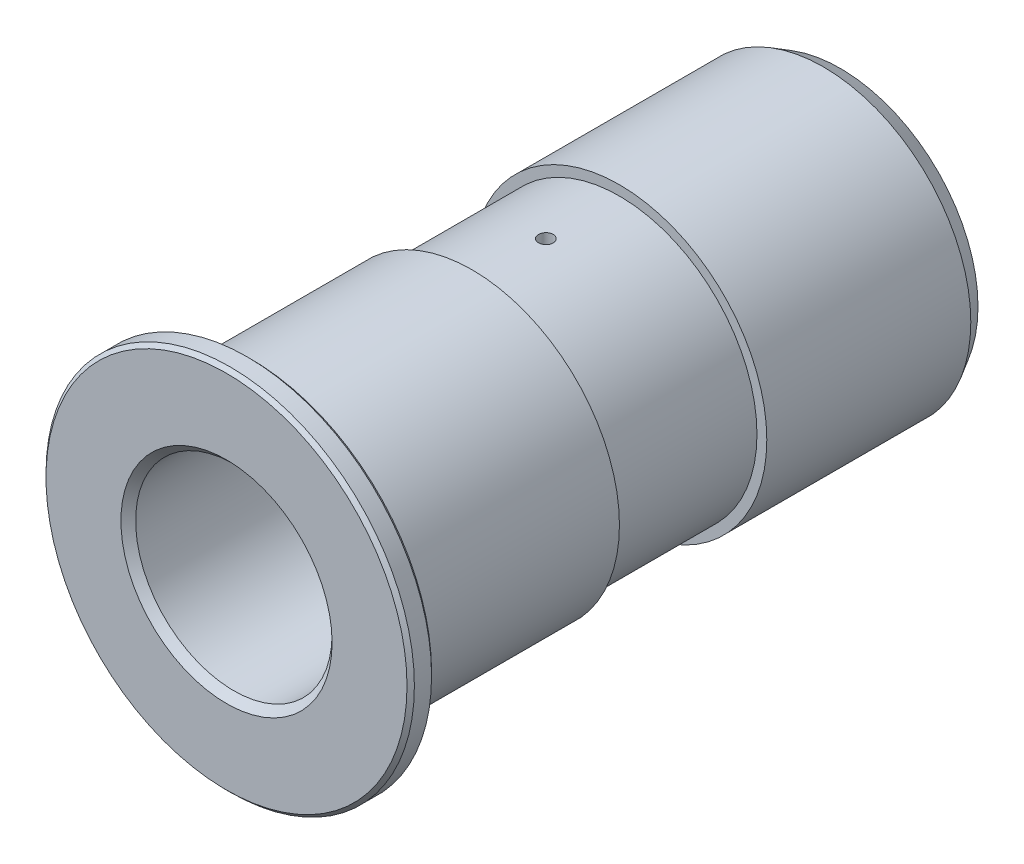
ISO-10303-21;
HEADER;
FILE_DESCRIPTION(('STEP AP214'),'2;1');
FILE_NAME('part.step','',(''),(''),'','','');
FILE_SCHEMA(('AUTOMOTIVE_DESIGN { 1 0 10303 214 1 1 1 1 }'));
ENDSEC;
DATA;
#1=APPLICATION_CONTEXT('core data for automotive mechanical design processes');
#2=APPLICATION_PROTOCOL_DEFINITION('international standard','automotive_design',2000,#1);
#3=PRODUCT_CONTEXT('',#1,'mechanical');
#4=PRODUCT('Part','Part','',(#3));
#5=PRODUCT_RELATED_PRODUCT_CATEGORY('part','',(#4));
#6=PRODUCT_DEFINITION_FORMATION('','',#4);
#7=PRODUCT_DEFINITION_CONTEXT('part definition',#1,'design');
#8=PRODUCT_DEFINITION('design','',#6,#7);
#9=PRODUCT_DEFINITION_SHAPE('','',#8);
#10=(LENGTH_UNIT() NAMED_UNIT(*) SI_UNIT(.MILLI.,.METRE.));
#11=(NAMED_UNIT(*) PLANE_ANGLE_UNIT() SI_UNIT($,.RADIAN.));
#12=(NAMED_UNIT(*) SI_UNIT($,.STERADIAN.) SOLID_ANGLE_UNIT());
#13=UNCERTAINTY_MEASURE_WITH_UNIT(LENGTH_MEASURE(1.E-05),#10,'distance_accuracy_value','');
#14=(GEOMETRIC_REPRESENTATION_CONTEXT(3) GLOBAL_UNCERTAINTY_ASSIGNED_CONTEXT((#13)) GLOBAL_UNIT_ASSIGNED_CONTEXT((#10,
#11,#12)) REPRESENTATION_CONTEXT('',''));
#15=CARTESIAN_POINT('',(0.,0.,0.));
#16=DIRECTION('',(0.,0.,1.));
#17=DIRECTION('',(1.,0.,0.));
#18=AXIS2_PLACEMENT_3D('',#15,#16,#17);
#19=CARTESIAN_POINT('',(0.,0.,120.));
#20=DIRECTION('',(0.,0.,-1.));
#21=DIRECTION('',(-1.,0.,0.));
#22=AXIS2_PLACEMENT_3D('',#19,#20,#21);
#23=CYLINDRICAL_SURFACE('',#22,20.);
#24=CARTESIAN_POINT('',(0.,0.,1.5));
#25=DIRECTION('',(0.,0.,1.));
#26=DIRECTION('',(1.,0.,0.));
#27=AXIS2_PLACEMENT_3D('',#24,#25,#26);
#28=CIRCLE('',#27,20.);
#29=CARTESIAN_POINT('',(20.,0.,1.5));
#30=VERTEX_POINT('',#29);
#31=EDGE_CURVE('E314',#30,#30,#28,.F.);
#32=ORIENTED_EDGE('',*,*,#31,.T.);
#33=EDGE_LOOP('',(#32));
#34=FACE_BOUND('',#33,.T.);
#35=CARTESIAN_POINT('',(0.,0.,123.5));
#36=DIRECTION('',(0.,0.,1.));
#37=DIRECTION('',(1.,0.,0.));
#38=AXIS2_PLACEMENT_3D('',#35,#36,#37);
#39=CIRCLE('',#38,20.);
#40=CARTESIAN_POINT('',(20.,0.,123.5));
#41=VERTEX_POINT('',#40);
#42=EDGE_CURVE('E311',#41,#41,#39,.T.);
#43=ORIENTED_EDGE('',*,*,#42,.T.);
#44=EDGE_LOOP('',(#43));
#45=FACE_BOUND('',#44,.T.);
#46=CARTESIAN_POINT('',(0.,20.,58.5));
#47=CARTESIAN_POINT('',(0.0841288095114434,19.9999992582729,58.500003686817));
#48=CARTESIAN_POINT('',(0.168315601024087,19.9994635090758,58.5071014534406));
#49=CARTESIAN_POINT('',(0.334361941971538,19.9973778078798,58.5353124845433));
#50=CARTESIAN_POINT('',(0.416218711162995,19.9958266932389,58.556441816237));
#51=CARTESIAN_POINT('',(0.575175965959818,19.9918856268593,58.6121033281197));
#52=CARTESIAN_POINT('',(0.652279036935091,19.9894961359011,58.6466281471085));
#53=CARTESIAN_POINT('',(0.799576480678018,19.9841466247064,58.7280879528637));
#54=CARTESIAN_POINT('',(0.869772371799851,19.9811867302827,58.775020203796));
#55=CARTESIAN_POINT('',(1.00142895753255,19.975021868989,58.8800692205375));
#56=CARTESIAN_POINT('',(1.06287322971853,19.971816458291,58.9382065440842));
#57=CARTESIAN_POINT('',(1.17514165369782,19.9655255838438,59.0639722973449));
#58=CARTESIAN_POINT('',(1.22596534904267,19.9624401252546,59.1316011347741));
#59=CARTESIAN_POINT('',(1.31560383874766,19.9567335395977,59.2745274548094));
#60=CARTESIAN_POINT('',(1.35440446810332,19.954112961772,59.3498338450301));
#61=CARTESIAN_POINT('',(1.41880489046782,19.9496376121017,59.5059153723438));
#62=CARTESIAN_POINT('',(1.44440487688688,19.947782829037,59.5866904292926));
#63=CARTESIAN_POINT('',(1.48163037657928,19.9450525889002,59.7512538924006));
#64=CARTESIAN_POINT('',(1.49328231044217,19.9441752805014,59.8350362908076));
#65=CARTESIAN_POINT('',(1.50236254574838,19.9434933892539,60.0033719532607));
#66=CARTESIAN_POINT('',(1.49979106810858,19.943688789744,60.0879252053135));
#67=CARTESIAN_POINT('',(1.48051934417569,19.9451285636931,60.2552218110539));
#68=CARTESIAN_POINT('',(1.46384775676394,19.9463708093904,60.3379684869642));
#69=CARTESIAN_POINT('',(1.4168935522692,19.9497609519804,60.4994856971156));
#70=CARTESIAN_POINT('',(1.38661082447336,19.9519088562398,60.5782561990087));
#71=CARTESIAN_POINT('',(1.31326167189701,19.9568707353614,60.7296767162388));
#72=CARTESIAN_POINT('',(1.27018232726497,19.9596853828031,60.8023204501768));
#73=CARTESIAN_POINT('',(1.17247213743424,19.9656629459514,60.9393566628649));
#74=CARTESIAN_POINT('',(1.11784110342877,19.9688258673499,61.0037490067223));
#75=CARTESIAN_POINT('',(0.998417278432276,19.9751530336147,61.1226212582436));
#76=CARTESIAN_POINT('',(0.933599700176315,19.9783172624229,61.1770762675947));
#77=CARTESIAN_POINT('',(0.795729375934443,19.9842830152099,61.2743357635657));
#78=CARTESIAN_POINT('',(0.722676625718591,19.9870845390023,61.3171402442013));
#79=CARTESIAN_POINT('',(0.570393940216335,19.9920096041928,61.3898818302438));
#80=CARTESIAN_POINT('',(0.491163509428978,19.9941330911371,61.4198179022413));
#81=CARTESIAN_POINT('',(0.328781652774543,19.9974621500133,61.4659558122048));
#82=CARTESIAN_POINT('',(0.245630292842573,19.998667737375,61.4821578810377));
#83=CARTESIAN_POINT('',(0.0779828437837496,20.0000231735387,61.5003368095389));
#84=CARTESIAN_POINT('',(-0.00650949482532258,20.0001755757578,61.5023480746542));
#85=CARTESIAN_POINT('',(-0.174630230993066,19.9994142771364,61.4921783319303));
#86=CARTESIAN_POINT('',(-0.2582586350546,19.9985005843262,61.4799974309947));
#87=CARTESIAN_POINT('',(-0.422180011176507,19.9957115375324,61.4418176311894));
#88=CARTESIAN_POINT('',(-0.502476701646073,19.9938372886011,61.4158346094413));
#89=CARTESIAN_POINT('',(-0.65757032738403,19.989337809084,61.3508043063633));
#90=CARTESIAN_POINT('',(-0.732367191799399,19.9867125688255,61.3117568567632));
#91=CARTESIAN_POINT('',(-0.87449495937676,19.9809993255836,61.2216191621021));
#92=CARTESIAN_POINT('',(-0.941811320255549,19.9779104477497,61.1705060432812));
#93=CARTESIAN_POINT('',(-1.06692059601702,19.9716201639251,61.0577210745309));
#94=CARTESIAN_POINT('',(-1.12471337673481,19.9684187563498,60.9960490758767));
#95=CARTESIAN_POINT('',(-1.22925234979154,19.9622567375937,60.8637480598679));
#96=CARTESIAN_POINT('',(-1.27597614708766,19.9592966224009,60.793101320567));
#97=CARTESIAN_POINT('',(-1.35689744472608,19.9539590285433,60.6449448016185));
#98=CARTESIAN_POINT('',(-1.39109504958689,19.951581545017,60.5674350792422));
#99=CARTESIAN_POINT('',(-1.44595479238458,19.9476809567371,60.4078331925127));
#100=CARTESIAN_POINT('',(-1.46663080672911,19.9461569763152,60.3257458201473));
#101=CARTESIAN_POINT('',(-1.49390569339177,19.9441328652441,60.1592527689843));
#102=CARTESIAN_POINT('',(-1.50050477907388,19.9436327190765,60.0748471253444));
#103=CARTESIAN_POINT('',(-1.49943621553155,19.9437130691626,59.9063360867526));
#104=CARTESIAN_POINT('',(-1.49180376085723,19.9442908995857,59.8222304651039));
#105=CARTESIAN_POINT('',(-1.46256198193398,19.9464564369575,59.65649891629));
#106=CARTESIAN_POINT('',(-1.44095263443384,19.9480441455862,59.5748729932502));
#107=CARTESIAN_POINT('',(-1.38437900273526,19.952049853556,59.4164143915782));
#108=CARTESIAN_POINT('',(-1.34941515840954,19.9544678255495,59.3395815551674));
#109=CARTESIAN_POINT('',(-1.26712924619683,19.9598616237908,59.1928710422854));
#110=CARTESIAN_POINT('',(-1.21980742681008,19.9628374388209,59.1229932259982));
#111=CARTESIAN_POINT('',(-1.11401708946728,19.9690203079162,58.991996650029));
#112=CARTESIAN_POINT('',(-1.05552268820001,19.972227887963,58.9308988183599));
#113=CARTESIAN_POINT('',(-0.929090973452718,19.9785081329158,58.8193659496892));
#114=CARTESIAN_POINT('',(-0.861151367795686,19.9815807648333,58.7689335084939));
#115=CARTESIAN_POINT('',(-0.717650416603836,19.9872494022766,58.6801088374609));
#116=CARTESIAN_POINT('',(-0.642077148267442,19.9898446437752,58.641735839509));
#117=CARTESIAN_POINT('',(-0.485593917915207,19.9942566719576,58.5782717155597));
#118=CARTESIAN_POINT('',(-0.404690263737665,19.9960743603405,58.5531651969317));
#119=CARTESIAN_POINT('',(-0.269417916724369,19.9982556200579,58.523398011473));
#120=CARTESIAN_POINT('',(-0.215921192938042,19.9989068154638,58.5146352812106));
#121=CARTESIAN_POINT('',(-0.108290987947989,19.9997792437292,58.5029350948477));
#122=CARTESIAN_POINT('',(-0.0541575080690678,20.0000004774832,58.4999976266296));
#123=CARTESIAN_POINT('',(0.,20.,58.5));
#124=B_SPLINE_CURVE_WITH_KNOTS('',3,(#46,#47,#48,#49,#50,#51,#52,#53,#54,#55,#56,#57,#58,#59,
#60,#61,#62,#63,#64,#65,#66,#67,#68,#69,#70,#71,#72,#73,#74,#75,#76,#77,#78,#79,#80,#81,#82,#83,
#84,#85,#86,#87,#88,#89,#90,#91,#92,#93,#94,#95,#96,#97,#98,#99,#100,#101,#102,#103,#104,#105,
#106,#107,#108,#109,#110,#111,#112,#113,#114,#115,#116,#117,#118,#119,#120,#121,#122,#123),
.UNSPECIFIED.,.T.,.F.,(4,2,2,2,2,2,2,2,2,2,2,2,2,2,2,2,2,2,2,2,2,2,2,2,2,2,2,2,2,2,2,2,2,2,2,2,
2,2,4),(0.,0.252188706341404,0.504666687116077,0.757006120137033,1.00928995874569,
1.26204114133441,1.51480318436673,1.76786189721255,2.02091690224424,2.27349180470371,
2.52606278420137,2.7781216361643,3.0301825384079,3.28249879898397,3.53481918386621,
3.78776333637314,4.04070761880367,4.29367221036427,4.54663254953898,4.79897937776532,
5.05132430518305,5.30337957695229,5.55543809532427,5.8079783521194,6.06052216631006,
6.31357265115638,6.56662102450255,6.81940930006922,7.07219374409737,7.32435388202407,
7.57651443943158,7.82866669184702,8.08081387425119,8.33355244628147,8.58635246072109,
8.83955360771712,9.09246032562224,9.25480590484756,9.41715114636384),.UNSPECIFIED.);
#125=CARTESIAN_POINT('',(0.,20.,58.5));
#126=VERTEX_POINT('',#125);
#127=EDGE_CURVE('E338',#126,#126,#124,.T.);
#128=ORIENTED_EDGE('',*,*,#127,.F.);
#129=EDGE_LOOP('',(#128));
#130=FACE_BOUND('',#129,.T.);
#131=ADVANCED_FACE('F285',(#34,#45,#130),#23,.F.);
#132=CARTESIAN_POINT('',(0.,0.,84.));
#133=DIRECTION('',(0.,0.,1.));
#134=DIRECTION('',(1.,0.,0.));
#135=AXIS2_PLACEMENT_3D('',#132,#133,#134);
#136=CYLINDRICAL_SURFACE('',#135,28.);
#137=CARTESIAN_POINT('',(0.,0.,75.));
#138=DIRECTION('',(0.,0.,1.));
#139=DIRECTION('',(1.,0.,0.));
#140=AXIS2_PLACEMENT_3D('',#137,#138,#139);
#141=CIRCLE('',#140,28.);
#142=CARTESIAN_POINT('',(28.,0.,75.));
#143=VERTEX_POINT('',#142);
#144=EDGE_CURVE('E335',#143,#143,#141,.T.);
#145=ORIENTED_EDGE('',*,*,#144,.F.);
#146=EDGE_LOOP('',(#145));
#147=FACE_BOUND('',#146,.T.);
#148=CARTESIAN_POINT('',(0.,0.,45.));
#149=DIRECTION('',(0.,0.,1.));
#150=DIRECTION('',(1.,0.,0.));
#151=AXIS2_PLACEMENT_3D('',#148,#149,#150);
#152=CIRCLE('',#151,28.);
#153=CARTESIAN_POINT('',(28.,0.,45.));
#154=VERTEX_POINT('',#153);
#155=EDGE_CURVE('E330',#154,#154,#152,.T.);
#156=ORIENTED_EDGE('',*,*,#155,.T.);
#157=EDGE_LOOP('',(#156));
#158=FACE_BOUND('',#157,.T.);
#159=CARTESIAN_POINT('',(0.,28.,58.5));
#160=CARTESIAN_POINT('',(-0.0841908703315507,27.9999994633478,58.5000037127301));
#161=CARTESIAN_POINT('',(-0.168441247563876,27.9996162149649,58.5071119119607));
#162=CARTESIAN_POINT('',(-0.334617260664676,27.9981242053863,58.535366800732));
#163=CARTESIAN_POINT('',(-0.416540048230791,27.9970145921236,58.556529977981));
#164=CARTESIAN_POINT('',(-0.575629652203331,27.9941954259342,58.6122866491888));
#165=CARTESIAN_POINT('',(-0.652798891177389,27.9924861816237,58.6468732354041));
#166=CARTESIAN_POINT('',(-0.800215644140056,27.9886601871014,58.7284841679811));
#167=CARTESIAN_POINT('',(-0.870464773958696,27.9865435323615,58.7755056013405));
#168=CARTESIAN_POINT('',(-1.00214789117652,27.9821380835772,58.8807107455357));
#169=CARTESIAN_POINT('',(-1.06357300498674,27.9798491197314,58.9389055570404));
#170=CARTESIAN_POINT('',(-1.1757887507803,27.9753584925727,59.0647831128231));
#171=CARTESIAN_POINT('',(-1.22657894576212,27.9731568328503,59.1324662467968));
#172=CARTESIAN_POINT('',(-1.31610854883793,27.9690878514182,59.2754469757024));
#173=CARTESIAN_POINT('',(-1.35484087788222,27.9672207263823,59.3507490093713));
#174=CARTESIAN_POINT('',(-1.41910990687632,27.9640334795802,59.5067987843025));
#175=CARTESIAN_POINT('',(-1.44464671792563,27.9627133532085,59.5875464797086));
#176=CARTESIAN_POINT('',(-1.4817759681405,27.9607705355445,59.7521124953809));
#177=CARTESIAN_POINT('',(-1.49338189794029,27.9601471695513,59.8359277638085));
#178=CARTESIAN_POINT('',(-1.50236156594204,27.9596661447874,60.0043189933196));
#179=CARTESIAN_POINT('',(-1.49973542930481,27.9598084792829,60.088894947707));
#180=CARTESIAN_POINT('',(-1.48033673509933,27.9608421776918,60.2563149917331));
#181=CARTESIAN_POINT('',(-1.46357875911026,27.9617327695313,60.3391607763442));
#182=CARTESIAN_POINT('',(-1.4164146859968,27.9641613919948,60.5008616972487));
#183=CARTESIAN_POINT('',(-1.38600852484424,27.9656994256561,60.5797168148187));
#184=CARTESIAN_POINT('',(-1.31239457374362,27.9692504778777,60.731244938816));
#185=CARTESIAN_POINT('',(-1.26918014463753,27.9712637426633,60.803914713867));
#186=CARTESIAN_POINT('',(-1.1711811856182,27.9755381014503,60.9409739868227));
#187=CARTESIAN_POINT('',(-1.11639656130506,27.9777991974737,61.0053634171621));
#188=CARTESIAN_POINT('',(-0.996730102302014,27.9823178117639,61.1241190820864));
#189=CARTESIAN_POINT('',(-0.931835642562154,27.9845753219427,61.1784725959165));
#190=CARTESIAN_POINT('',(-0.793835968382742,27.9888295905212,61.2755154829418));
#191=CARTESIAN_POINT('',(-0.720730751722382,27.9908263488505,61.3182048529821));
#192=CARTESIAN_POINT('',(-0.568377238078069,27.9943341902617,61.3907064764334));
#193=CARTESIAN_POINT('',(-0.48912872468935,27.995845256225,61.4205182759736));
#194=CARTESIAN_POINT('',(-0.326741530396962,27.9982111759337,61.4664101482981));
#195=CARTESIAN_POINT('',(-0.24360288291049,27.9990660353149,61.4824903390172));
#196=CARTESIAN_POINT('',(-0.0759058371935288,28.0000224768456,61.500446835753));
#197=CARTESIAN_POINT('',(0.00865067213041166,28.0001249920132,61.5023407349284));
#198=CARTESIAN_POINT('',(0.176880258384262,27.9995676703029,61.4919168147528));
#199=CARTESIAN_POINT('',(0.260553338674799,27.9989078363261,61.4795990494836));
#200=CARTESIAN_POINT('',(0.424591528071889,27.9969007256478,61.4411160194418));
#201=CARTESIAN_POINT('',(0.504958529397876,27.9955538482588,61.4149587978907));
#202=CARTESIAN_POINT('',(0.660161556435217,27.9923242610898,61.3495475207112));
#203=CARTESIAN_POINT('',(0.734997545565594,27.9904415477662,61.3102933784721));
#204=CARTESIAN_POINT('',(0.877094954453581,27.9863496945997,61.2197575653302));
#205=CARTESIAN_POINT('',(0.944348858136602,27.9841402357839,61.1684641124553));
#206=CARTESIAN_POINT('',(1.06929740900974,27.9796447391046,61.0553229076545));
#207=CARTESIAN_POINT('',(1.1269919862735,27.9773587006811,60.9934750785302));
#208=CARTESIAN_POINT('',(1.23124347439574,27.9729650296767,60.8609050117409));
#209=CARTESIAN_POINT('',(1.27778899430772,27.9708575809684,60.7901738094542));
#210=CARTESIAN_POINT('',(1.35834324256427,27.967061640593,60.6418900263175));
#211=CARTESIAN_POINT('',(1.39235203148905,27.9653731469015,60.5643374784319));
#212=CARTESIAN_POINT('',(1.44684760668971,27.9626068399447,60.404654480596));
#213=CARTESIAN_POINT('',(1.4673416303323,27.9615286998696,60.322526506455));
#214=CARTESIAN_POINT('',(1.4942495866905,27.9601037644532,60.1559893900993));
#215=CARTESIAN_POINT('',(1.50066361503558,27.9597569641449,60.0715802633819));
#216=CARTESIAN_POINT('',(1.4992286084332,27.9598339378658,59.9029902536741));
#217=CARTESIAN_POINT('',(1.4913974896175,27.960256743961,59.8188092171546));
#218=CARTESIAN_POINT('',(1.46173155028394,27.9618232324073,59.6529589457787));
#219=CARTESIAN_POINT('',(1.43989670338969,27.9629669161162,59.5712897156537));
#220=CARTESIAN_POINT('',(1.38284689429682,27.9658460391189,59.412777913703));
#221=CARTESIAN_POINT('',(1.34763187736732,27.9675814808333,59.3359353616221));
#222=CARTESIAN_POINT('',(1.26482422527973,27.9714484814745,59.1892517310065));
#223=CARTESIAN_POINT('',(1.21723195429362,27.9735800287463,59.1194104465595));
#224=CARTESIAN_POINT('',(1.11095584910966,27.9780020895241,58.9886219104349));
#225=CARTESIAN_POINT('',(1.05225936002346,27.9802927824967,58.9276849483689));
#226=CARTESIAN_POINT('',(0.925452465262194,27.9847736065645,58.816510109708));
#227=CARTESIAN_POINT('',(0.857339750582702,27.9869637128184,58.766274865041));
#228=CARTESIAN_POINT('',(0.713574120508165,27.9909982865974,58.6779024448057));
#229=CARTESIAN_POINT('',(0.637913503835541,27.9928423954537,58.6397777953025));
#230=CARTESIAN_POINT('',(0.481311514193597,27.9959719822449,58.5768186430357));
#231=CARTESIAN_POINT('',(0.400376491745974,27.9972581182056,58.5519684774259));
#232=CARTESIAN_POINT('',(0.265783850006309,27.998787484093,58.5227663230907));
#233=CARTESIAN_POINT('',(0.212997554966114,27.9992401733854,58.5142398882343));
#234=CARTESIAN_POINT('',(0.106815492032727,27.9998466014459,58.5028555516147));
#235=CARTESIAN_POINT('',(0.0534197247423332,28.0000003405098,58.4999976442455));
#236=CARTESIAN_POINT('',(0.,28.,58.5));
#237=B_SPLINE_CURVE_WITH_KNOTS('',3,(#159,#160,#161,#162,#163,#164,#165,#166,#167,#168,#169,
#170,#171,#172,#173,#174,#175,#176,#177,#178,#179,#180,#181,#182,#183,#184,#185,#186,#187,#188,
#189,#190,#191,#192,#193,#194,#195,#196,#197,#198,#199,#200,#201,#202,#203,#204,#205,#206,#207,
#208,#209,#210,#211,#212,#213,#214,#215,#216,#217,#218,#219,#220,#221,#222,#223,#224,#225,#226,
#227,#228,#229,#230,#231,#232,#233,#234,#235,#236),.UNSPECIFIED.,.T.,.F.,(4,2,2,2,2,2,2,2,2,2,2,
2,2,2,2,2,2,2,2,2,2,2,2,2,2,2,2,2,2,2,2,2,2,2,2,2,2,2,4),(0.,0.252377605995383,
0.505051797002766,0.757596132831542,1.01008135964684,1.2628187389368,1.51556650147044,
1.76846237100883,2.02135611125906,2.27400475168352,2.52665117024834,2.77903722054677,
3.0314244548846,3.28394274347601,3.53646309241489,3.78930135179949,4.04213967957077,
4.29498691791672,4.54783198464203,4.8003634330364,5.05289392043696,5.30527780300942,
5.55766335464756,5.81029693459517,6.06293236247245,6.31582481635638,6.56871604819329,
6.82147174263416,7.07422572038633,7.32666202904346,7.57909881317264,7.8315366298923,
8.08396702005484,8.33668684394065,8.58946874893025,8.84251126290193,9.09525454341021,
9.25539014390326,9.41552558602792),.UNSPECIFIED.);
#238=CARTESIAN_POINT('',(0.,28.,58.5));
#239=VERTEX_POINT('',#238);
#240=EDGE_CURVE('E346',#239,#239,#237,.T.);
#241=ORIENTED_EDGE('',*,*,#240,.F.);
#242=EDGE_LOOP('',(#241));
#243=FACE_BOUND('',#242,.T.);
#244=ADVANCED_FACE('F369',(#147,#158,#243),#136,.T.);
#245=CARTESIAN_POINT('',(0.,0.,120.));
#246=DIRECTION('',(0.,0.,-1.));
#247=DIRECTION('',(-1.,0.,0.));
#248=AXIS2_PLACEMENT_3D('',#245,#246,#247);
#249=CYLINDRICAL_SURFACE('',#248,30.);
#250=CARTESIAN_POINT('',(0.,0.,3.46410161513769));
#251=DIRECTION('',(0.,0.,1.));
#252=DIRECTION('',(1.,0.,0.));
#253=AXIS2_PLACEMENT_3D('',#250,#251,#252);
#254=CIRCLE('',#253,30.);
#255=CARTESIAN_POINT('',(30.,0.,3.46410161513769));
#256=VERTEX_POINT('',#255);
#257=EDGE_CURVE('E320',#256,#256,#254,.T.);
#258=ORIENTED_EDGE('',*,*,#257,.T.);
#259=EDGE_LOOP('',(#258));
#260=FACE_BOUND('',#259,.T.);
#261=CARTESIAN_POINT('',(0.,0.,45.));
#262=DIRECTION('',(0.,0.,1.));
#263=DIRECTION('',(1.,0.,0.));
#264=AXIS2_PLACEMENT_3D('',#261,#262,#263);
#265=CIRCLE('',#264,30.);
#266=CARTESIAN_POINT('',(30.,0.,45.));
#267=VERTEX_POINT('',#266);
#268=EDGE_CURVE('E324',#267,#267,#265,.T.);
#269=ORIENTED_EDGE('',*,*,#268,.F.);
#270=EDGE_LOOP('',(#269));
#271=FACE_BOUND('',#270,.T.);
#272=ADVANCED_FACE('F372',(#260,#271),#249,.T.);
#273=CARTESIAN_POINT('',(0.,0.,120.));
#274=DIRECTION('',(0.,0.,1.));
#275=DIRECTION('',(1.,0.,0.));
#276=AXIS2_PLACEMENT_3D('',#273,#274,#275);
#277=CIRCLE('',#276,30.);
#278=CARTESIAN_POINT('',(30.,0.,120.));
#279=VERTEX_POINT('',#278);
#280=EDGE_CURVE('E323',#279,#279,#277,.T.);
#281=ORIENTED_EDGE('',*,*,#280,.F.);
#282=EDGE_LOOP('',(#281));
#283=FACE_BOUND('',#282,.T.);
#284=CARTESIAN_POINT('',(0.,0.,75.));
#285=DIRECTION('',(0.,0.,-1.));
#286=DIRECTION('',(-1.,0.,0.));
#287=AXIS2_PLACEMENT_3D('',#284,#285,#286);
#288=CIRCLE('',#287,30.);
#289=CARTESIAN_POINT('',(-30.,0.,75.));
#290=VERTEX_POINT('',#289);
#291=EDGE_CURVE('E327',#290,#290,#288,.T.);
#292=ORIENTED_EDGE('',*,*,#291,.F.);
#293=EDGE_LOOP('',(#292));
#294=FACE_BOUND('',#293,.T.);
#295=ADVANCED_FACE('F389',(#283,#294),#249,.T.);
#296=CARTESIAN_POINT('',(0.,0.,0.));
#297=DIRECTION('',(0.,0.,1.));
#298=DIRECTION('',(1.,0.,0.));
#299=AXIS2_PLACEMENT_3D('',#296,#297,#298);
#300=PLANE('',#299);
#301=CARTESIAN_POINT('',(0.,0.,0.));
#302=DIRECTION('',(0.,0.,1.));
#303=DIRECTION('',(1.,0.,0.));
#304=AXIS2_PLACEMENT_3D('',#301,#302,#303);
#305=CIRCLE('',#304,21.5);
#306=CARTESIAN_POINT('',(21.5,0.,0.));
#307=VERTEX_POINT('',#306);
#308=EDGE_CURVE('E305',#307,#307,#305,.T.);
#309=ORIENTED_EDGE('',*,*,#308,.T.);
#310=EDGE_LOOP('',(#309));
#311=FACE_BOUND('',#310,.T.);
#312=CARTESIAN_POINT('',(0.,0.,0.));
#313=DIRECTION('',(0.,0.,1.));
#314=DIRECTION('',(1.,0.,0.));
#315=AXIS2_PLACEMENT_3D('',#312,#313,#314);
#316=CIRCLE('',#315,28.);
#317=CARTESIAN_POINT('',(28.,0.,0.));
#318=VERTEX_POINT('',#317);
#319=EDGE_CURVE('E317',#318,#318,#316,.F.);
#320=ORIENTED_EDGE('',*,*,#319,.T.);
#321=EDGE_LOOP('',(#320));
#322=FACE_BOUND('',#321,.T.);
#323=ADVANCED_FACE('F380',(#311,#322),#300,.F.);
#324=CARTESIAN_POINT('',(0.,0.,120.));
#325=DIRECTION('',(0.,0.,1.));
#326=DIRECTION('',(1.,0.,0.));
#327=AXIS2_PLACEMENT_3D('',#324,#325,#326);
#328=PLANE('',#327);
#329=CARTESIAN_POINT('',(0.,0.,120.));
#330=DIRECTION('',(0.,0.,1.));
#331=DIRECTION('',(1.,0.,0.));
#332=AXIS2_PLACEMENT_3D('',#329,#330,#331);
#333=CIRCLE('',#332,36.75);
#334=CARTESIAN_POINT('',(36.75,0.,120.));
#335=VERTEX_POINT('',#334);
#336=EDGE_CURVE('E292',#335,#335,#333,.F.);
#337=ORIENTED_EDGE('',*,*,#336,.T.);
#338=EDGE_LOOP('',(#337));
#339=FACE_BOUND('',#338,.T.);
#340=ORIENTED_EDGE('',*,*,#280,.T.);
#341=EDGE_LOOP('',(#340));
#342=FACE_BOUND('',#341,.T.);
#343=ADVANCED_FACE('F377',(#339,#342),#328,.F.);
#344=CARTESIAN_POINT('',(0.,0.,125.));
#345=DIRECTION('',(0.,0.,1.));
#346=DIRECTION('',(1.,0.,0.));
#347=AXIS2_PLACEMENT_3D('',#344,#345,#346);
#348=PLANE('',#347);
#349=CARTESIAN_POINT('',(0.,0.,125.));
#350=DIRECTION('',(0.,0.,1.));
#351=DIRECTION('',(1.,0.,0.));
#352=AXIS2_PLACEMENT_3D('',#349,#350,#351);
#353=CIRCLE('',#352,36.75);
#354=CARTESIAN_POINT('',(36.75,0.,125.));
#355=VERTEX_POINT('',#354);
#356=EDGE_CURVE('E13',#355,#355,#353,.T.);
#357=ORIENTED_EDGE('',*,*,#356,.T.);
#358=EDGE_LOOP('',(#357));
#359=FACE_BOUND('',#358,.T.);
#360=CARTESIAN_POINT('',(0.,0.,125.));
#361=DIRECTION('',(0.,0.,1.));
#362=DIRECTION('',(1.,0.,0.));
#363=AXIS2_PLACEMENT_3D('',#360,#361,#362);
#364=CIRCLE('',#363,21.5);
#365=CARTESIAN_POINT('',(21.5,0.,125.));
#366=VERTEX_POINT('',#365);
#367=EDGE_CURVE('E308',#366,#366,#364,.F.);
#368=ORIENTED_EDGE('',*,*,#367,.T.);
#369=EDGE_LOOP('',(#368));
#370=FACE_BOUND('',#369,.T.);
#371=ADVANCED_FACE('F374',(#359,#370),#348,.T.);
#372=CARTESIAN_POINT('',(0.,0.,125.));
#373=DIRECTION('',(0.,0.,-1.));
#374=DIRECTION('',(-1.,0.,0.));
#375=AXIS2_PLACEMENT_3D('',#372,#373,#374);
#376=CYLINDRICAL_SURFACE('',#375,37.5);
#377=CARTESIAN_POINT('',(0.,0.,120.75));
#378=DIRECTION('',(0.,0.,1.));
#379=DIRECTION('',(1.,0.,0.));
#380=AXIS2_PLACEMENT_3D('',#377,#378,#379);
#381=CIRCLE('',#380,37.5);
#382=CARTESIAN_POINT('',(37.5,0.,120.75));
#383=VERTEX_POINT('',#382);
#384=EDGE_CURVE('E296',#383,#383,#381,.T.);
#385=ORIENTED_EDGE('',*,*,#384,.T.);
#386=EDGE_LOOP('',(#385));
#387=FACE_BOUND('',#386,.T.);
#388=CARTESIAN_POINT('',(0.,0.,124.25));
#389=DIRECTION('',(0.,0.,1.));
#390=DIRECTION('',(1.,0.,0.));
#391=AXIS2_PLACEMENT_3D('',#388,#389,#390);
#392=CIRCLE('',#391,37.5);
#393=CARTESIAN_POINT('',(37.5,0.,124.25));
#394=VERTEX_POINT('',#393);
#395=EDGE_CURVE('E300',#394,#394,#392,.F.);
#396=ORIENTED_EDGE('',*,*,#395,.T.);
#397=EDGE_LOOP('',(#396));
#398=FACE_BOUND('',#397,.T.);
#399=ADVANCED_FACE('F367',(#387,#398),#376,.T.);
#400=CARTESIAN_POINT('',(-32.,0.,45.));
#401=DIRECTION('',(0.,0.,1.));
#402=DIRECTION('',(1.,0.,0.));
#403=AXIS2_PLACEMENT_3D('',#400,#401,#402);
#404=PLANE('',#403);
#405=ORIENTED_EDGE('',*,*,#155,.F.);
#406=EDGE_LOOP('',(#405));
#407=FACE_BOUND('',#406,.T.);
#408=ORIENTED_EDGE('',*,*,#268,.T.);
#409=EDGE_LOOP('',(#408));
#410=FACE_BOUND('',#409,.T.);
#411=ADVANCED_FACE('F363',(#407,#410),#404,.T.);
#412=CARTESIAN_POINT('',(-32.,0.,75.));
#413=DIRECTION('',(0.,0.,-1.));
#414=DIRECTION('',(-1.,0.,0.));
#415=AXIS2_PLACEMENT_3D('',#412,#413,#414);
#416=PLANE('',#415);
#417=ORIENTED_EDGE('',*,*,#144,.T.);
#418=EDGE_LOOP('',(#417));
#419=FACE_BOUND('',#418,.T.);
#420=ORIENTED_EDGE('',*,*,#291,.T.);
#421=EDGE_LOOP('',(#420));
#422=FACE_BOUND('',#421,.T.);
#423=ADVANCED_FACE('F358',(#419,#422),#416,.T.);
#424=CARTESIAN_POINT('',(0.,0.,3.46410161513769));
#425=DIRECTION('',(0.,0.,1.));
#426=DIRECTION('',(1.,0.,0.));
#427=AXIS2_PLACEMENT_3D('',#424,#425,#426);
#428=CONICAL_SURFACE('',#427,30.,0.5235987755983);
#429=ORIENTED_EDGE('',*,*,#319,.F.);
#430=EDGE_LOOP('',(#429));
#431=FACE_BOUND('',#430,.T.);
#432=ORIENTED_EDGE('',*,*,#257,.F.);
#433=EDGE_LOOP('',(#432));
#434=FACE_BOUND('',#433,.T.);
#435=ADVANCED_FACE('F362',(#431,#434),#428,.T.);
#436=CARTESIAN_POINT('',(0.,0.,123.5));
#437=DIRECTION('',(0.,0.,1.));
#438=DIRECTION('',(1.,0.,0.));
#439=AXIS2_PLACEMENT_3D('',#436,#437,#438);
#440=CONICAL_SURFACE('',#439,20.,0.78539816339745);
#441=ORIENTED_EDGE('',*,*,#367,.F.);
#442=EDGE_LOOP('',(#441));
#443=FACE_BOUND('',#442,.T.);
#444=ORIENTED_EDGE('',*,*,#42,.F.);
#445=EDGE_LOOP('',(#444));
#446=FACE_BOUND('',#445,.T.);
#447=ADVANCED_FACE('F396',(#443,#446),#440,.F.);
#448=CARTESIAN_POINT('',(0.,0.,0.));
#449=DIRECTION('',(0.,0.,-1.));
#450=DIRECTION('',(-1.,0.,0.));
#451=AXIS2_PLACEMENT_3D('',#448,#449,#450);
#452=CONICAL_SURFACE('',#451,21.5,0.785398163397445);
#453=ORIENTED_EDGE('',*,*,#31,.F.);
#454=EDGE_LOOP('',(#453));
#455=FACE_BOUND('',#454,.T.);
#456=ORIENTED_EDGE('',*,*,#308,.F.);
#457=EDGE_LOOP('',(#456));
#458=FACE_BOUND('',#457,.T.);
#459=ADVANCED_FACE('F400',(#455,#458),#452,.F.);
#460=CARTESIAN_POINT('',(0.,0.,120.75));
#461=DIRECTION('',(0.,0.,1.));
#462=DIRECTION('',(1.,0.,0.));
#463=AXIS2_PLACEMENT_3D('',#460,#461,#462);
#464=CONICAL_SURFACE('',#463,37.5,0.785398163397439);
#465=ORIENTED_EDGE('',*,*,#336,.F.);
#466=EDGE_LOOP('',(#465));
#467=FACE_BOUND('',#466,.T.);
#468=ORIENTED_EDGE('',*,*,#384,.F.);
#469=EDGE_LOOP('',(#468));
#470=FACE_BOUND('',#469,.T.);
#471=ADVANCED_FACE('F403',(#467,#470),#464,.T.);
#472=CARTESIAN_POINT('',(0.,0.,125.));
#473=DIRECTION('',(0.,0.,-1.));
#474=DIRECTION('',(-1.,0.,0.));
#475=AXIS2_PLACEMENT_3D('',#472,#473,#474);
#476=CONICAL_SURFACE('',#475,36.75,0.785398163397467);
#477=ORIENTED_EDGE('',*,*,#395,.F.);
#478=EDGE_LOOP('',(#477));
#479=FACE_BOUND('',#478,.T.);
#480=ORIENTED_EDGE('',*,*,#356,.F.);
#481=EDGE_LOOP('',(#480));
#482=FACE_BOUND('',#481,.T.);
#483=ADVANCED_FACE('F287',(#479,#482),#476,.T.);
#484=CARTESIAN_POINT('',(0.,37.501,60.));
#485=DIRECTION('',(0.,-1.,0.));
#486=DIRECTION('',(0.,0.,-1.));
#487=AXIS2_PLACEMENT_3D('',#484,#485,#486);
#488=CYLINDRICAL_SURFACE('',#487,1.5);
#489=ORIENTED_EDGE('',*,*,#127,.T.);
#490=EDGE_LOOP('',(#489));
#491=FACE_BOUND('',#490,.T.);
#492=ORIENTED_EDGE('',*,*,#240,.T.);
#493=EDGE_LOOP('',(#492));
#494=FACE_BOUND('',#493,.T.);
#495=ADVANCED_FACE('F351',(#491,#494),#488,.F.);
#496=CLOSED_SHELL('',(#131,#244,#272,#295,#323,#343,#371,#399,#411,#423,#435,#447,#459,#471,
#483,#495));
#497=MANIFOLD_SOLID_BREP('B2',#496);
#498=ADVANCED_BREP_SHAPE_REPRESENTATION('',(#18,#497),#14);
#499=SHAPE_DEFINITION_REPRESENTATION(#9,#498);
ENDSEC;
END-ISO-10303-21;
